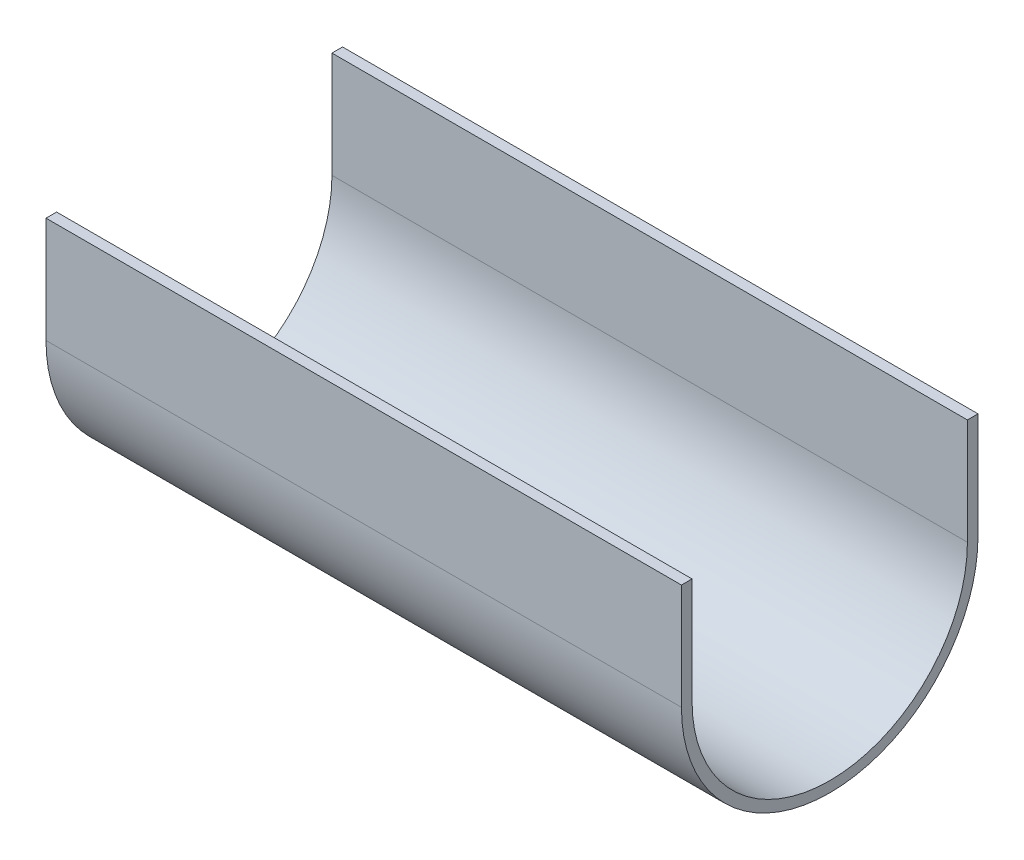
ISO-10303-21;
HEADER;
FILE_DESCRIPTION(('STEP AP214'),'2;1');
FILE_NAME('part.step','',(''),(''),'','','');
FILE_SCHEMA(('AUTOMOTIVE_DESIGN { 1 0 10303 214 1 1 1 1 }'));
ENDSEC;
DATA;
#1=APPLICATION_CONTEXT('core data for automotive mechanical design processes');
#2=APPLICATION_PROTOCOL_DEFINITION('international standard','automotive_design',2000,#1);
#3=PRODUCT_CONTEXT('',#1,'mechanical');
#4=PRODUCT('Part','Part','',(#3));
#5=PRODUCT_RELATED_PRODUCT_CATEGORY('part','',(#4));
#6=PRODUCT_DEFINITION_FORMATION('','',#4);
#7=PRODUCT_DEFINITION_CONTEXT('part definition',#1,'design');
#8=PRODUCT_DEFINITION('design','',#6,#7);
#9=PRODUCT_DEFINITION_SHAPE('','',#8);
#10=(LENGTH_UNIT() NAMED_UNIT(*) SI_UNIT(.MILLI.,.METRE.));
#11=(NAMED_UNIT(*) PLANE_ANGLE_UNIT() SI_UNIT($,.RADIAN.));
#12=(NAMED_UNIT(*) SI_UNIT($,.STERADIAN.) SOLID_ANGLE_UNIT());
#13=UNCERTAINTY_MEASURE_WITH_UNIT(LENGTH_MEASURE(1.E-05),#10,'distance_accuracy_value','');
#14=(GEOMETRIC_REPRESENTATION_CONTEXT(3) GLOBAL_UNCERTAINTY_ASSIGNED_CONTEXT((#13)) GLOBAL_UNIT_ASSIGNED_CONTEXT((#10,
#11,#12)) REPRESENTATION_CONTEXT('',''));
#15=CARTESIAN_POINT('',(0.,0.,0.));
#16=DIRECTION('',(0.,0.,1.));
#17=DIRECTION('',(1.,0.,0.));
#18=AXIS2_PLACEMENT_3D('',#15,#16,#17);
#19=CARTESIAN_POINT('',(120.,20.,-28.));
#20=DIRECTION('',(0.,0.,1.));
#21=DIRECTION('',(0.,-1.,0.));
#22=AXIS2_PLACEMENT_3D('',#19,#20,#21);
#23=PLANE('',#22);
#24=DIRECTION('',(-1.,0.,0.));
#25=VECTOR('',#24,1.);
#26=CARTESIAN_POINT('',(120.,0.,-28.));
#27=LINE('',#26,#25);
#28=CARTESIAN_POINT('',(120.,0.,-28.));
#29=VERTEX_POINT('',#28);
#30=CARTESIAN_POINT('',(0.,0.,-28.));
#31=VERTEX_POINT('',#30);
#32=EDGE_CURVE('E106',#29,#31,#27,.T.);
#33=ORIENTED_EDGE('',*,*,#32,.T.);
#34=DIRECTION('',(0.,-1.,0.));
#35=VECTOR('',#34,1.);
#36=CARTESIAN_POINT('',(0.,20.,-28.));
#37=LINE('',#36,#35);
#38=CARTESIAN_POINT('',(0.,20.,-28.));
#39=VERTEX_POINT('',#38);
#40=EDGE_CURVE('E144',#39,#31,#37,.T.);
#41=ORIENTED_EDGE('',*,*,#40,.F.);
#42=DIRECTION('',(-1.,0.,0.));
#43=VECTOR('',#42,1.);
#44=CARTESIAN_POINT('',(120.,20.,-28.));
#45=LINE('',#44,#43);
#46=CARTESIAN_POINT('',(120.,20.,-28.));
#47=VERTEX_POINT('',#46);
#48=EDGE_CURVE('E138',#47,#39,#45,.T.);
#49=ORIENTED_EDGE('',*,*,#48,.F.);
#50=DIRECTION('',(0.,-1.,0.));
#51=VECTOR('',#50,1.);
#52=CARTESIAN_POINT('',(120.,20.,-28.));
#53=LINE('',#52,#51);
#54=EDGE_CURVE('E155',#47,#29,#53,.T.);
#55=ORIENTED_EDGE('',*,*,#54,.T.);
#56=EDGE_LOOP('',(#33,#41,#49,#55));
#57=FACE_BOUND('',#56,.T.);
#58=ADVANCED_FACE('F39',(#57),#23,.F.);
#59=CARTESIAN_POINT('',(0.,20.,-26.));
#60=DIRECTION('',(0.,0.,-1.));
#61=DIRECTION('',(0.,1.,0.));
#62=AXIS2_PLACEMENT_3D('',#59,#60,#61);
#63=PLANE('',#62);
#64=DIRECTION('',(-1.,0.,0.));
#65=VECTOR('',#64,1.);
#66=CARTESIAN_POINT('',(120.,0.,-26.));
#67=LINE('',#66,#65);
#68=CARTESIAN_POINT('',(120.,0.,-26.));
#69=VERTEX_POINT('',#68);
#70=CARTESIAN_POINT('',(0.,0.,-26.));
#71=VERTEX_POINT('',#70);
#72=EDGE_CURVE('E109',#69,#71,#67,.T.);
#73=ORIENTED_EDGE('',*,*,#72,.F.);
#74=DIRECTION('',(0.,-1.,0.));
#75=VECTOR('',#74,1.);
#76=CARTESIAN_POINT('',(120.,20.,-26.));
#77=LINE('',#76,#75);
#78=CARTESIAN_POINT('',(120.,20.,-26.));
#79=VERTEX_POINT('',#78);
#80=EDGE_CURVE('E153',#79,#69,#77,.T.);
#81=ORIENTED_EDGE('',*,*,#80,.F.);
#82=DIRECTION('',(1.,0.,0.));
#83=VECTOR('',#82,1.);
#84=CARTESIAN_POINT('',(0.,20.,-26.));
#85=LINE('',#84,#83);
#86=CARTESIAN_POINT('',(0.,20.,-26.));
#87=VERTEX_POINT('',#86);
#88=EDGE_CURVE('E158',#87,#79,#85,.T.);
#89=ORIENTED_EDGE('',*,*,#88,.F.);
#90=DIRECTION('',(0.,-1.,0.));
#91=VECTOR('',#90,1.);
#92=CARTESIAN_POINT('',(0.,20.,-26.));
#93=LINE('',#92,#91);
#94=EDGE_CURVE('E156',#87,#71,#93,.T.);
#95=ORIENTED_EDGE('',*,*,#94,.T.);
#96=EDGE_LOOP('',(#73,#81,#89,#95));
#97=FACE_BOUND('',#96,.T.);
#98=ADVANCED_FACE('F175',(#97),#63,.F.);
#99=CARTESIAN_POINT('',(0.,20.,0.));
#100=DIRECTION('',(0.,1.,0.));
#101=DIRECTION('',(0.,0.,1.));
#102=AXIS2_PLACEMENT_3D('',#99,#100,#101);
#103=PLANE('',#102);
#104=ORIENTED_EDGE('',*,*,#48,.T.);
#105=DIRECTION('',(0.,0.,1.));
#106=VECTOR('',#105,1.);
#107=CARTESIAN_POINT('',(0.,20.,-28.));
#108=LINE('',#107,#106);
#109=EDGE_CURVE('E182',#39,#87,#108,.T.);
#110=ORIENTED_EDGE('',*,*,#109,.T.);
#111=ORIENTED_EDGE('',*,*,#88,.T.);
#112=DIRECTION('',(0.,0.,-1.));
#113=VECTOR('',#112,1.);
#114=CARTESIAN_POINT('',(120.,20.,-26.));
#115=LINE('',#114,#113);
#116=EDGE_CURVE('E79',#79,#47,#115,.T.);
#117=ORIENTED_EDGE('',*,*,#116,.T.);
#118=EDGE_LOOP('',(#104,#110,#111,#117));
#119=FACE_BOUND('',#118,.T.);
#120=ADVANCED_FACE('F184',(#119),#103,.T.);
#121=CARTESIAN_POINT('',(120.,0.,0.));
#122=DIRECTION('',(-1.,0.,0.));
#123=DIRECTION('',(0.,0.,1.));
#124=AXIS2_PLACEMENT_3D('',#121,#122,#123);
#125=CYLINDRICAL_SURFACE('',#124,26.);
#126=CARTESIAN_POINT('',(0.,0.,0.));
#127=DIRECTION('',(-1.,0.,0.));
#128=DIRECTION('',(0.,0.,1.));
#129=AXIS2_PLACEMENT_3D('',#126,#127,#128);
#130=CIRCLE('',#129,26.);
#131=CARTESIAN_POINT('',(0.,0.,26.));
#132=VERTEX_POINT('',#131);
#133=EDGE_CURVE('E141',#71,#132,#130,.T.);
#134=ORIENTED_EDGE('',*,*,#133,.T.);
#135=DIRECTION('',(-1.,0.,0.));
#136=VECTOR('',#135,1.);
#137=CARTESIAN_POINT('',(120.,0.,26.));
#138=LINE('',#137,#136);
#139=CARTESIAN_POINT('',(120.,0.,26.));
#140=VERTEX_POINT('',#139);
#141=EDGE_CURVE('E11',#140,#132,#138,.T.);
#142=ORIENTED_EDGE('',*,*,#141,.F.);
#143=CARTESIAN_POINT('',(120.,0.,0.));
#144=DIRECTION('',(-1.,0.,0.));
#145=DIRECTION('',(0.,0.,1.));
#146=AXIS2_PLACEMENT_3D('',#143,#144,#145);
#147=CIRCLE('',#146,26.);
#148=EDGE_CURVE('E57',#69,#140,#147,.T.);
#149=ORIENTED_EDGE('',*,*,#148,.F.);
#150=ORIENTED_EDGE('',*,*,#72,.T.);
#151=EDGE_LOOP('',(#134,#142,#149,#150));
#152=FACE_BOUND('',#151,.T.);
#153=ADVANCED_FACE('F41',(#152),#125,.F.);
#154=CARTESIAN_POINT('',(120.,0.,0.));
#155=DIRECTION('',(-1.,0.,0.));
#156=DIRECTION('',(0.,0.,1.));
#157=AXIS2_PLACEMENT_3D('',#154,#155,#156);
#158=CYLINDRICAL_SURFACE('',#157,28.);
#159=CARTESIAN_POINT('',(0.,0.,0.));
#160=DIRECTION('',(1.,0.,0.));
#161=DIRECTION('',(0.,0.,1.));
#162=AXIS2_PLACEMENT_3D('',#159,#160,#161);
#163=CIRCLE('',#162,28.);
#164=CARTESIAN_POINT('',(0.,0.,28.));
#165=VERTEX_POINT('',#164);
#166=EDGE_CURVE('E143',#165,#31,#163,.T.);
#167=ORIENTED_EDGE('',*,*,#166,.T.);
#168=ORIENTED_EDGE('',*,*,#32,.F.);
#169=CARTESIAN_POINT('',(120.,0.,0.));
#170=DIRECTION('',(1.,0.,0.));
#171=DIRECTION('',(0.,0.,1.));
#172=AXIS2_PLACEMENT_3D('',#169,#170,#171);
#173=CIRCLE('',#172,28.);
#174=CARTESIAN_POINT('',(120.,0.,28.));
#175=VERTEX_POINT('',#174);
#176=EDGE_CURVE('E103',#175,#29,#173,.T.);
#177=ORIENTED_EDGE('',*,*,#176,.F.);
#178=DIRECTION('',(-1.,0.,0.));
#179=VECTOR('',#178,1.);
#180=CARTESIAN_POINT('',(120.,0.,28.));
#181=LINE('',#180,#179);
#182=EDGE_CURVE('E48',#175,#165,#181,.T.);
#183=ORIENTED_EDGE('',*,*,#182,.T.);
#184=EDGE_LOOP('',(#167,#168,#177,#183));
#185=FACE_BOUND('',#184,.T.);
#186=ADVANCED_FACE('F102',(#185),#158,.T.);
#187=CARTESIAN_POINT('',(120.,0.,0.));
#188=DIRECTION('',(-1.,0.,0.));
#189=DIRECTION('',(0.,0.,1.));
#190=AXIS2_PLACEMENT_3D('',#187,#188,#189);
#191=PLANE('',#190);
#192=ORIENTED_EDGE('',*,*,#148,.T.);
#193=DIRECTION('',(0.,-1.,0.));
#194=VECTOR('',#193,1.);
#195=CARTESIAN_POINT('',(120.,20.,26.));
#196=LINE('',#195,#194);
#197=CARTESIAN_POINT('',(120.,20.,26.));
#198=VERTEX_POINT('',#197);
#199=EDGE_CURVE('E121',#198,#140,#196,.T.);
#200=ORIENTED_EDGE('',*,*,#199,.F.);
#201=DIRECTION('',(0.,0.,-1.));
#202=VECTOR('',#201,1.);
#203=CARTESIAN_POINT('',(120.,20.,28.));
#204=LINE('',#203,#202);
#205=CARTESIAN_POINT('',(120.,20.,28.));
#206=VERTEX_POINT('',#205);
#207=EDGE_CURVE('E124',#206,#198,#204,.T.);
#208=ORIENTED_EDGE('',*,*,#207,.F.);
#209=DIRECTION('',(0.,-1.,0.));
#210=VECTOR('',#209,1.);
#211=CARTESIAN_POINT('',(120.,20.,28.));
#212=LINE('',#211,#210);
#213=EDGE_CURVE('E117',#206,#175,#212,.T.);
#214=ORIENTED_EDGE('',*,*,#213,.T.);
#215=ORIENTED_EDGE('',*,*,#176,.T.);
#216=ORIENTED_EDGE('',*,*,#54,.F.);
#217=ORIENTED_EDGE('',*,*,#116,.F.);
#218=ORIENTED_EDGE('',*,*,#80,.T.);
#219=EDGE_LOOP('',(#192,#200,#208,#214,#215,#216,#217,#218));
#220=FACE_BOUND('',#219,.T.);
#221=ADVANCED_FACE('F122',(#220),#191,.F.);
#222=CARTESIAN_POINT('',(0.,0.,0.));
#223=DIRECTION('',(-1.,0.,0.));
#224=DIRECTION('',(0.,0.,1.));
#225=AXIS2_PLACEMENT_3D('',#222,#223,#224);
#226=PLANE('',#225);
#227=ORIENTED_EDGE('',*,*,#133,.F.);
#228=ORIENTED_EDGE('',*,*,#94,.F.);
#229=ORIENTED_EDGE('',*,*,#109,.F.);
#230=ORIENTED_EDGE('',*,*,#40,.T.);
#231=ORIENTED_EDGE('',*,*,#166,.F.);
#232=DIRECTION('',(0.,-1.,0.));
#233=VECTOR('',#232,1.);
#234=CARTESIAN_POINT('',(0.,20.,28.));
#235=LINE('',#234,#233);
#236=CARTESIAN_POINT('',(0.,20.,28.));
#237=VERTEX_POINT('',#236);
#238=EDGE_CURVE('E120',#237,#165,#235,.T.);
#239=ORIENTED_EDGE('',*,*,#238,.F.);
#240=DIRECTION('',(0.,0.,1.));
#241=VECTOR('',#240,1.);
#242=CARTESIAN_POINT('',(0.,20.,26.));
#243=LINE('',#242,#241);
#244=CARTESIAN_POINT('',(0.,20.,26.));
#245=VERTEX_POINT('',#244);
#246=EDGE_CURVE('E135',#245,#237,#243,.T.);
#247=ORIENTED_EDGE('',*,*,#246,.F.);
#248=DIRECTION('',(0.,-1.,0.));
#249=VECTOR('',#248,1.);
#250=CARTESIAN_POINT('',(0.,20.,26.));
#251=LINE('',#250,#249);
#252=EDGE_CURVE('E126',#245,#132,#251,.T.);
#253=ORIENTED_EDGE('',*,*,#252,.T.);
#254=EDGE_LOOP('',(#227,#228,#229,#230,#231,#239,#247,#253));
#255=FACE_BOUND('',#254,.T.);
#256=ADVANCED_FACE('F169',(#255),#226,.T.);
#257=CARTESIAN_POINT('',(120.,20.,26.));
#258=DIRECTION('',(0.,0.,1.));
#259=DIRECTION('',(0.,-1.,0.));
#260=AXIS2_PLACEMENT_3D('',#257,#258,#259);
#261=PLANE('',#260);
#262=ORIENTED_EDGE('',*,*,#141,.T.);
#263=ORIENTED_EDGE('',*,*,#252,.F.);
#264=DIRECTION('',(-1.,0.,0.));
#265=VECTOR('',#264,1.);
#266=CARTESIAN_POINT('',(120.,20.,26.));
#267=LINE('',#266,#265);
#268=EDGE_CURVE('E140',#198,#245,#267,.T.);
#269=ORIENTED_EDGE('',*,*,#268,.F.);
#270=ORIENTED_EDGE('',*,*,#199,.T.);
#271=EDGE_LOOP('',(#262,#263,#269,#270));
#272=FACE_BOUND('',#271,.T.);
#273=ADVANCED_FACE('F172',(#272),#261,.F.);
#274=CARTESIAN_POINT('',(0.,20.,28.));
#275=DIRECTION('',(0.,0.,-1.));
#276=DIRECTION('',(0.,1.,0.));
#277=AXIS2_PLACEMENT_3D('',#274,#275,#276);
#278=PLANE('',#277);
#279=ORIENTED_EDGE('',*,*,#182,.F.);
#280=ORIENTED_EDGE('',*,*,#213,.F.);
#281=DIRECTION('',(1.,0.,0.));
#282=VECTOR('',#281,1.);
#283=CARTESIAN_POINT('',(0.,20.,28.));
#284=LINE('',#283,#282);
#285=EDGE_CURVE('E134',#237,#206,#284,.T.);
#286=ORIENTED_EDGE('',*,*,#285,.F.);
#287=ORIENTED_EDGE('',*,*,#238,.T.);
#288=EDGE_LOOP('',(#279,#280,#286,#287));
#289=FACE_BOUND('',#288,.T.);
#290=ADVANCED_FACE('F113',(#289),#278,.F.);
#291=CARTESIAN_POINT('',(0.,20.,0.));
#292=DIRECTION('',(0.,1.,0.));
#293=DIRECTION('',(0.,0.,1.));
#294=AXIS2_PLACEMENT_3D('',#291,#292,#293);
#295=PLANE('',#294);
#296=ORIENTED_EDGE('',*,*,#268,.T.);
#297=ORIENTED_EDGE('',*,*,#246,.T.);
#298=ORIENTED_EDGE('',*,*,#285,.T.);
#299=ORIENTED_EDGE('',*,*,#207,.T.);
#300=EDGE_LOOP('',(#296,#297,#298,#299));
#301=FACE_BOUND('',#300,.T.);
#302=ADVANCED_FACE('F179',(#301),#295,.T.);
#303=CLOSED_SHELL('',(#58,#98,#120,#153,#186,#221,#256,#273,#290,#302));
#304=MANIFOLD_SOLID_BREP('B2',#303);
#305=ADVANCED_BREP_SHAPE_REPRESENTATION('',(#18,#304),#14);
#306=SHAPE_DEFINITION_REPRESENTATION(#9,#305);
ENDSEC;
END-ISO-10303-21;
